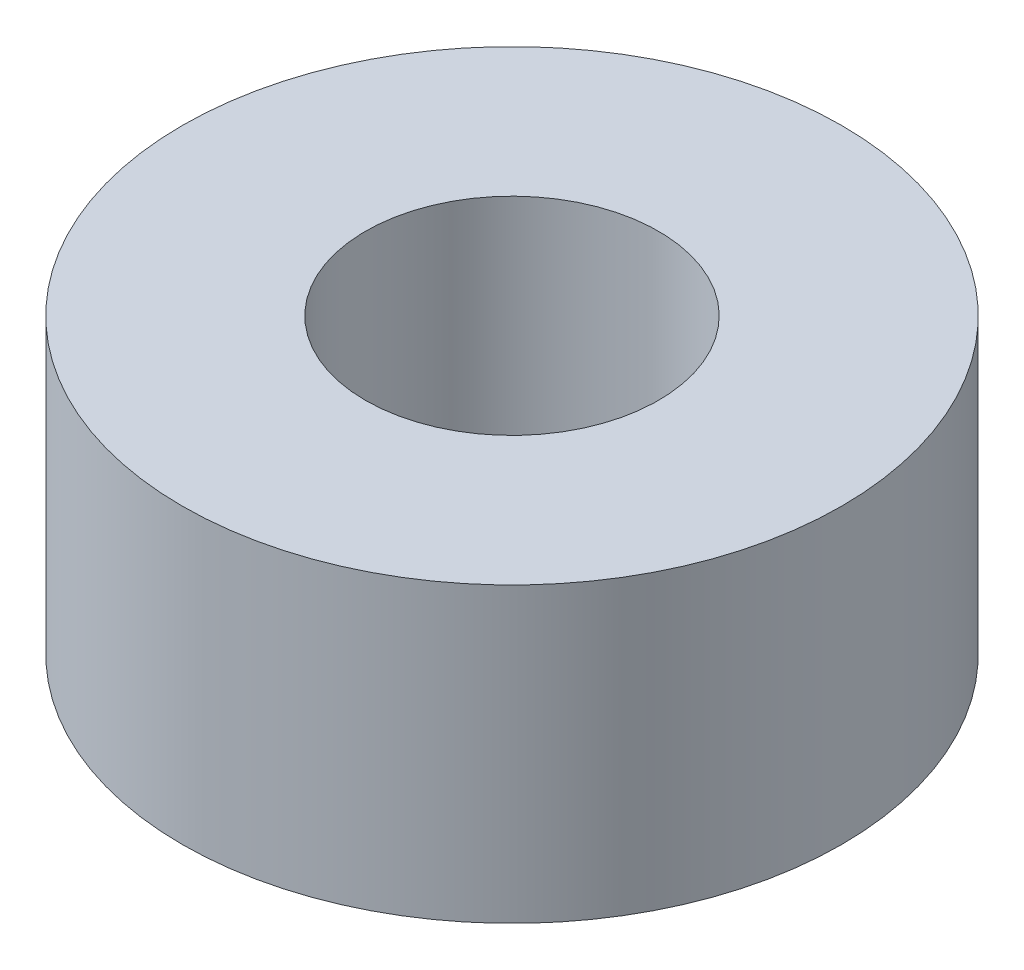
ISO-10303-21;
HEADER;
FILE_DESCRIPTION(('STEP AP214'),'2;1');
FILE_NAME('part.step','',(''),(''),'','','');
FILE_SCHEMA(('AUTOMOTIVE_DESIGN { 1 0 10303 214 1 1 1 1 }'));
ENDSEC;
DATA;
#1=APPLICATION_CONTEXT('core data for automotive mechanical design processes');
#2=APPLICATION_PROTOCOL_DEFINITION('international standard','automotive_design',2000,#1);
#3=PRODUCT_CONTEXT('',#1,'mechanical');
#4=PRODUCT('Part','Part','',(#3));
#5=PRODUCT_RELATED_PRODUCT_CATEGORY('part','',(#4));
#6=PRODUCT_DEFINITION_FORMATION('','',#4);
#7=PRODUCT_DEFINITION_CONTEXT('part definition',#1,'design');
#8=PRODUCT_DEFINITION('design','',#6,#7);
#9=PRODUCT_DEFINITION_SHAPE('','',#8);
#10=(LENGTH_UNIT() NAMED_UNIT(*) SI_UNIT(.MILLI.,.METRE.));
#11=(NAMED_UNIT(*) PLANE_ANGLE_UNIT() SI_UNIT($,.RADIAN.));
#12=(NAMED_UNIT(*) SI_UNIT($,.STERADIAN.) SOLID_ANGLE_UNIT());
#13=UNCERTAINTY_MEASURE_WITH_UNIT(LENGTH_MEASURE(1.E-05),#10,'distance_accuracy_value','');
#14=(GEOMETRIC_REPRESENTATION_CONTEXT(3) GLOBAL_UNCERTAINTY_ASSIGNED_CONTEXT((#13)) GLOBAL_UNIT_ASSIGNED_CONTEXT((#10,
#11,#12)) REPRESENTATION_CONTEXT('',''));
#15=CARTESIAN_POINT('',(0.,0.,0.));
#16=DIRECTION('',(0.,0.,1.));
#17=DIRECTION('',(1.,0.,0.));
#18=AXIS2_PLACEMENT_3D('',#15,#16,#17);
#19=CARTESIAN_POINT('',(0.,4.,0.));
#20=DIRECTION('',(0.,1.,0.));
#21=DIRECTION('',(0.,0.,1.));
#22=AXIS2_PLACEMENT_3D('',#19,#20,#21);
#23=PLANE('',#22);
#24=CARTESIAN_POINT('',(0.,4.,0.));
#25=DIRECTION('',(0.,1.,0.));
#26=DIRECTION('',(0.,0.,1.));
#27=AXIS2_PLACEMENT_3D('',#24,#25,#26);
#28=CIRCLE('',#27,4.5);
#29=CARTESIAN_POINT('',(0.,4.,4.5));
#30=VERTEX_POINT('',#29);
#31=EDGE_CURVE('E10',#30,#30,#28,.T.);
#32=ORIENTED_EDGE('',*,*,#31,.T.);
#33=EDGE_LOOP('',(#32));
#34=FACE_BOUND('',#33,.T.);
#35=CARTESIAN_POINT('',(0.,4.,0.));
#36=DIRECTION('',(0.,1.,0.));
#37=DIRECTION('',(0.,0.,1.));
#38=AXIS2_PLACEMENT_3D('',#35,#36,#37);
#39=CIRCLE('',#38,2.);
#40=CARTESIAN_POINT('',(0.,4.,2.));
#41=VERTEX_POINT('',#40);
#42=EDGE_CURVE('E50',#41,#41,#39,.T.);
#43=ORIENTED_EDGE('',*,*,#42,.F.);
#44=EDGE_LOOP('',(#43));
#45=FACE_BOUND('',#44,.T.);
#46=ADVANCED_FACE('F39',(#34,#45),#23,.T.);
#47=CARTESIAN_POINT('',(0.,0.,0.));
#48=DIRECTION('',(0.,1.,0.));
#49=DIRECTION('',(0.,0.,1.));
#50=AXIS2_PLACEMENT_3D('',#47,#48,#49);
#51=PLANE('',#50);
#52=CARTESIAN_POINT('',(0.,0.,0.));
#53=DIRECTION('',(0.,1.,0.));
#54=DIRECTION('',(0.,0.,1.));
#55=AXIS2_PLACEMENT_3D('',#52,#53,#54);
#56=CIRCLE('',#55,4.5);
#57=CARTESIAN_POINT('',(0.,0.,4.5));
#58=VERTEX_POINT('',#57);
#59=EDGE_CURVE('E43',#58,#58,#56,.T.);
#60=ORIENTED_EDGE('',*,*,#59,.F.);
#61=EDGE_LOOP('',(#60));
#62=FACE_BOUND('',#61,.T.);
#63=CARTESIAN_POINT('',(0.,0.,0.));
#64=DIRECTION('',(0.,1.,0.));
#65=DIRECTION('',(0.,0.,1.));
#66=AXIS2_PLACEMENT_3D('',#63,#64,#65);
#67=CIRCLE('',#66,2.);
#68=CARTESIAN_POINT('',(0.,0.,2.));
#69=VERTEX_POINT('',#68);
#70=EDGE_CURVE('E52',#69,#69,#67,.T.);
#71=ORIENTED_EDGE('',*,*,#70,.T.);
#72=EDGE_LOOP('',(#71));
#73=FACE_BOUND('',#72,.T.);
#74=ADVANCED_FACE('F62',(#62,#73),#51,.F.);
#75=CARTESIAN_POINT('',(0.,4.,0.));
#76=DIRECTION('',(0.,-1.,0.));
#77=DIRECTION('',(0.,0.,-1.));
#78=AXIS2_PLACEMENT_3D('',#75,#76,#77);
#79=CYLINDRICAL_SURFACE('',#78,4.5);
#80=ORIENTED_EDGE('',*,*,#31,.F.);
#81=EDGE_LOOP('',(#80));
#82=FACE_BOUND('',#81,.T.);
#83=ORIENTED_EDGE('',*,*,#59,.T.);
#84=EDGE_LOOP('',(#83));
#85=FACE_BOUND('',#84,.T.);
#86=ADVANCED_FACE('F41',(#82,#85),#79,.T.);
#87=CARTESIAN_POINT('',(0.,4.,0.));
#88=DIRECTION('',(0.,-1.,0.));
#89=DIRECTION('',(0.,0.,-1.));
#90=AXIS2_PLACEMENT_3D('',#87,#88,#89);
#91=CYLINDRICAL_SURFACE('',#90,2.);
#92=ORIENTED_EDGE('',*,*,#42,.T.);
#93=EDGE_LOOP('',(#92));
#94=FACE_BOUND('',#93,.T.);
#95=ORIENTED_EDGE('',*,*,#70,.F.);
#96=EDGE_LOOP('',(#95));
#97=FACE_BOUND('',#96,.T.);
#98=ADVANCED_FACE('F58',(#94,#97),#91,.F.);
#99=CLOSED_SHELL('',(#46,#74,#86,#98));
#100=MANIFOLD_SOLID_BREP('B2',#99);
#101=ADVANCED_BREP_SHAPE_REPRESENTATION('',(#18,#100),#14);
#102=SHAPE_DEFINITION_REPRESENTATION(#9,#101);
ENDSEC;
END-ISO-10303-21;
